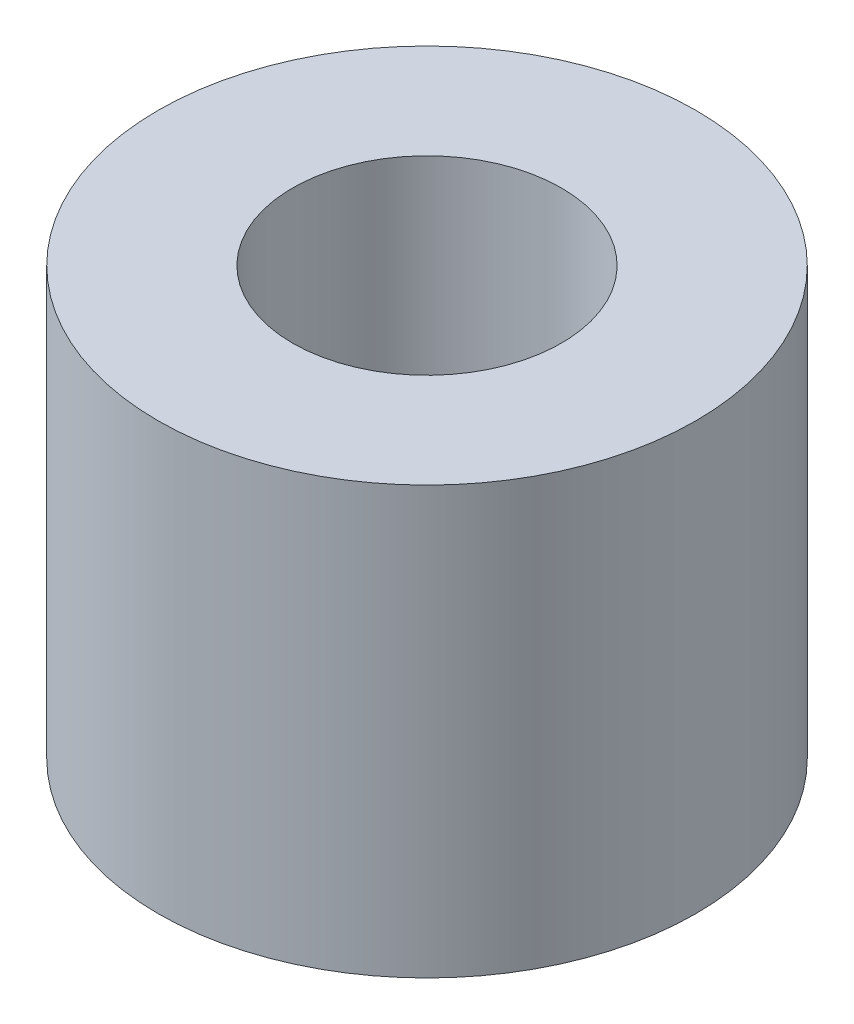
ISO-10303-21;
HEADER;
FILE_DESCRIPTION(('STEP AP214'),'2;1');
FILE_NAME('part.step','',(''),(''),'','','');
FILE_SCHEMA(('AUTOMOTIVE_DESIGN { 1 0 10303 214 1 1 1 1 }'));
ENDSEC;
DATA;
#1=APPLICATION_CONTEXT('core data for automotive mechanical design processes');
#2=APPLICATION_PROTOCOL_DEFINITION('international standard','automotive_design',2000,#1);
#3=PRODUCT_CONTEXT('',#1,'mechanical');
#4=PRODUCT('Part','Part','',(#3));
#5=PRODUCT_RELATED_PRODUCT_CATEGORY('part','',(#4));
#6=PRODUCT_DEFINITION_FORMATION('','',#4);
#7=PRODUCT_DEFINITION_CONTEXT('part definition',#1,'design');
#8=PRODUCT_DEFINITION('design','',#6,#7);
#9=PRODUCT_DEFINITION_SHAPE('','',#8);
#10=(LENGTH_UNIT() NAMED_UNIT(*) SI_UNIT(.MILLI.,.METRE.));
#11=(NAMED_UNIT(*) PLANE_ANGLE_UNIT() SI_UNIT($,.RADIAN.));
#12=(NAMED_UNIT(*) SI_UNIT($,.STERADIAN.) SOLID_ANGLE_UNIT());
#13=UNCERTAINTY_MEASURE_WITH_UNIT(LENGTH_MEASURE(1.E-05),#10,'distance_accuracy_value','');
#14=(GEOMETRIC_REPRESENTATION_CONTEXT(3) GLOBAL_UNCERTAINTY_ASSIGNED_CONTEXT((#13)) GLOBAL_UNIT_ASSIGNED_CONTEXT((#10,
#11,#12)) REPRESENTATION_CONTEXT('',''));
#15=CARTESIAN_POINT('',(0.,0.,0.));
#16=DIRECTION('',(0.,0.,1.));
#17=DIRECTION('',(1.,0.,0.));
#18=AXIS2_PLACEMENT_3D('',#15,#16,#17);
#19=CARTESIAN_POINT('',(0.,6.35,0.));
#20=DIRECTION('',(0.,1.,0.));
#21=DIRECTION('',(0.,0.,1.));
#22=AXIS2_PLACEMENT_3D('',#19,#20,#21);
#23=PLANE('',#22);
#24=CARTESIAN_POINT('',(0.,6.35,0.));
#25=DIRECTION('',(0.,1.,0.));
#26=DIRECTION('',(0.,0.,1.));
#27=AXIS2_PLACEMENT_3D('',#24,#25,#26);
#28=CIRCLE('',#27,4.);
#29=CARTESIAN_POINT('',(0.,6.35,4.));
#30=VERTEX_POINT('',#29);
#31=EDGE_CURVE('E10',#30,#30,#28,.T.);
#32=ORIENTED_EDGE('',*,*,#31,.T.);
#33=EDGE_LOOP('',(#32));
#34=FACE_BOUND('',#33,.T.);
#35=CARTESIAN_POINT('',(0.,6.35,0.));
#36=DIRECTION('',(0.,1.,0.));
#37=DIRECTION('',(0.,0.,1.));
#38=AXIS2_PLACEMENT_3D('',#35,#36,#37);
#39=CIRCLE('',#38,2.);
#40=CARTESIAN_POINT('',(0.,6.35,2.));
#41=VERTEX_POINT('',#40);
#42=EDGE_CURVE('E50',#41,#41,#39,.T.);
#43=ORIENTED_EDGE('',*,*,#42,.F.);
#44=EDGE_LOOP('',(#43));
#45=FACE_BOUND('',#44,.T.);
#46=ADVANCED_FACE('F37',(#34,#45),#23,.T.);
#47=CARTESIAN_POINT('',(0.,0.,0.));
#48=DIRECTION('',(0.,1.,0.));
#49=DIRECTION('',(0.,0.,1.));
#50=AXIS2_PLACEMENT_3D('',#47,#48,#49);
#51=PLANE('',#50);
#52=CARTESIAN_POINT('',(0.,0.,0.));
#53=DIRECTION('',(0.,1.,0.));
#54=DIRECTION('',(0.,0.,1.));
#55=AXIS2_PLACEMENT_3D('',#52,#53,#54);
#56=CIRCLE('',#55,4.);
#57=CARTESIAN_POINT('',(0.,0.,4.));
#58=VERTEX_POINT('',#57);
#59=EDGE_CURVE('E41',#58,#58,#56,.T.);
#60=ORIENTED_EDGE('',*,*,#59,.F.);
#61=EDGE_LOOP('',(#60));
#62=FACE_BOUND('',#61,.T.);
#63=CARTESIAN_POINT('',(0.,0.,0.));
#64=DIRECTION('',(0.,1.,0.));
#65=DIRECTION('',(0.,0.,1.));
#66=AXIS2_PLACEMENT_3D('',#63,#64,#65);
#67=CIRCLE('',#66,2.);
#68=CARTESIAN_POINT('',(0.,0.,2.));
#69=VERTEX_POINT('',#68);
#70=EDGE_CURVE('E52',#69,#69,#67,.T.);
#71=ORIENTED_EDGE('',*,*,#70,.T.);
#72=EDGE_LOOP('',(#71));
#73=FACE_BOUND('',#72,.T.);
#74=ADVANCED_FACE('F64',(#62,#73),#51,.F.);
#75=CARTESIAN_POINT('',(0.,6.35,0.));
#76=DIRECTION('',(0.,-1.,0.));
#77=DIRECTION('',(0.,0.,-1.));
#78=AXIS2_PLACEMENT_3D('',#75,#76,#77);
#79=CYLINDRICAL_SURFACE('',#78,4.);
#80=ORIENTED_EDGE('',*,*,#31,.F.);
#81=EDGE_LOOP('',(#80));
#82=FACE_BOUND('',#81,.T.);
#83=ORIENTED_EDGE('',*,*,#59,.T.);
#84=EDGE_LOOP('',(#83));
#85=FACE_BOUND('',#84,.T.);
#86=ADVANCED_FACE('F39',(#82,#85),#79,.T.);
#87=CARTESIAN_POINT('',(0.,6.35,0.));
#88=DIRECTION('',(0.,-1.,0.));
#89=DIRECTION('',(0.,0.,-1.));
#90=AXIS2_PLACEMENT_3D('',#87,#88,#89);
#91=CYLINDRICAL_SURFACE('',#90,2.);
#92=ORIENTED_EDGE('',*,*,#42,.T.);
#93=EDGE_LOOP('',(#92));
#94=FACE_BOUND('',#93,.T.);
#95=ORIENTED_EDGE('',*,*,#70,.F.);
#96=EDGE_LOOP('',(#95));
#97=FACE_BOUND('',#96,.T.);
#98=ADVANCED_FACE('F60',(#94,#97),#91,.F.);
#99=CLOSED_SHELL('',(#46,#74,#86,#98));
#100=MANIFOLD_SOLID_BREP('B2',#99);
#101=ADVANCED_BREP_SHAPE_REPRESENTATION('',(#18,#100),#14);
#102=SHAPE_DEFINITION_REPRESENTATION(#9,#101);
ENDSEC;
END-ISO-10303-21;
